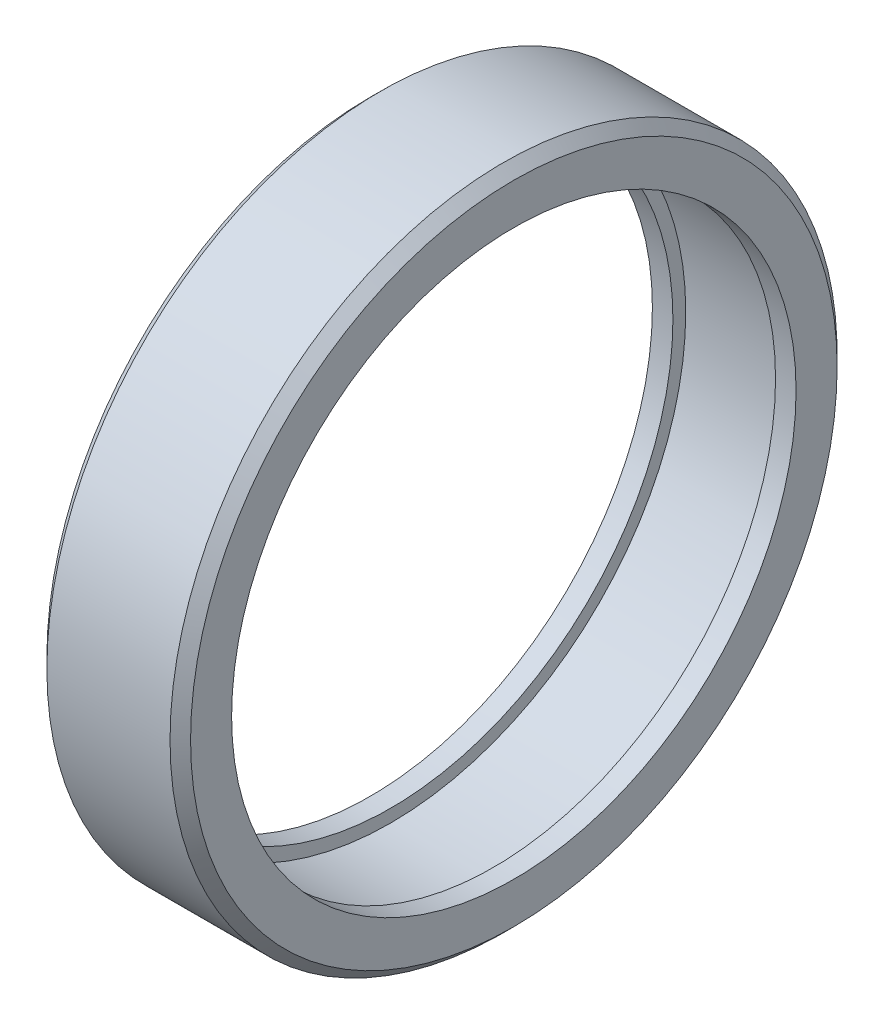
ISO-10303-21;
HEADER;
FILE_DESCRIPTION(('STEP AP214'),'2;1');
FILE_NAME('part.step','',(''),(''),'','','');
FILE_SCHEMA(('AUTOMOTIVE_DESIGN { 1 0 10303 214 1 1 1 1 }'));
ENDSEC;
DATA;
#1=APPLICATION_CONTEXT('core data for automotive mechanical design processes');
#2=APPLICATION_PROTOCOL_DEFINITION('international standard','automotive_design',2000,#1);
#3=PRODUCT_CONTEXT('',#1,'mechanical');
#4=PRODUCT('Part','Part','',(#3));
#5=PRODUCT_RELATED_PRODUCT_CATEGORY('part','',(#4));
#6=PRODUCT_DEFINITION_FORMATION('','',#4);
#7=PRODUCT_DEFINITION_CONTEXT('part definition',#1,'design');
#8=PRODUCT_DEFINITION('design','',#6,#7);
#9=PRODUCT_DEFINITION_SHAPE('','',#8);
#10=(LENGTH_UNIT() NAMED_UNIT(*) SI_UNIT(.MILLI.,.METRE.));
#11=(NAMED_UNIT(*) PLANE_ANGLE_UNIT() SI_UNIT($,.RADIAN.));
#12=(NAMED_UNIT(*) SI_UNIT($,.STERADIAN.) SOLID_ANGLE_UNIT());
#13=UNCERTAINTY_MEASURE_WITH_UNIT(LENGTH_MEASURE(1.E-05),#10,'distance_accuracy_value','');
#14=(GEOMETRIC_REPRESENTATION_CONTEXT(3) GLOBAL_UNCERTAINTY_ASSIGNED_CONTEXT((#13)) GLOBAL_UNIT_ASSIGNED_CONTEXT((#10,
#11,#12)) REPRESENTATION_CONTEXT('',''));
#15=CARTESIAN_POINT('',(0.,0.,0.));
#16=DIRECTION('',(0.,0.,1.));
#17=DIRECTION('',(1.,0.,0.));
#18=AXIS2_PLACEMENT_3D('',#15,#16,#17);
#19=CARTESIAN_POINT('',(-10.,55.,0.));
#20=DIRECTION('',(-1.,0.,0.));
#21=DIRECTION('',(0.,0.,1.));
#22=AXIS2_PLACEMENT_3D('',#19,#20,#21);
#23=PLANE('',#22);
#24=CARTESIAN_POINT('',(-10.,0.,0.));
#25=DIRECTION('',(-1.,0.,0.));
#26=DIRECTION('',(0.,0.,1.));
#27=AXIS2_PLACEMENT_3D('',#24,#25,#26);
#28=CIRCLE('',#27,57.5);
#29=CARTESIAN_POINT('',(-10.,0.,57.5));
#30=VERTEX_POINT('',#29);
#31=EDGE_CURVE('E64',#30,#30,#28,.T.);
#32=ORIENTED_EDGE('',*,*,#31,.F.);
#33=EDGE_LOOP('',(#32));
#34=FACE_BOUND('',#33,.T.);
#35=CARTESIAN_POINT('',(-10.,0.,0.));
#36=DIRECTION('',(-1.,0.,0.));
#37=DIRECTION('',(0.,0.,1.));
#38=AXIS2_PLACEMENT_3D('',#35,#36,#37);
#39=CIRCLE('',#38,55.);
#40=CARTESIAN_POINT('',(-10.,0.,55.));
#41=VERTEX_POINT('',#40);
#42=EDGE_CURVE('E84',#41,#41,#39,.T.);
#43=ORIENTED_EDGE('',*,*,#42,.T.);
#44=EDGE_LOOP('',(#43));
#45=FACE_BOUND('',#44,.T.);
#46=ADVANCED_FACE('F39',(#34,#45),#23,.F.);
#47=CARTESIAN_POINT('',(0.,0.,0.));
#48=DIRECTION('',(-1.,0.,0.));
#49=DIRECTION('',(0.,0.,1.));
#50=AXIS2_PLACEMENT_3D('',#47,#48,#49);
#51=CYLINDRICAL_SURFACE('',#50,57.5);
#52=CARTESIAN_POINT('',(10.,0.,0.));
#53=DIRECTION('',(-1.,0.,0.));
#54=DIRECTION('',(0.,0.,1.));
#55=AXIS2_PLACEMENT_3D('',#52,#53,#54);
#56=CIRCLE('',#55,57.5);
#57=CARTESIAN_POINT('',(10.,0.,57.5));
#58=VERTEX_POINT('',#57);
#59=EDGE_CURVE('E68',#58,#58,#56,.T.);
#60=ORIENTED_EDGE('',*,*,#59,.F.);
#61=EDGE_LOOP('',(#60));
#62=FACE_BOUND('',#61,.T.);
#63=ORIENTED_EDGE('',*,*,#31,.T.);
#64=EDGE_LOOP('',(#63));
#65=FACE_BOUND('',#64,.T.);
#66=ADVANCED_FACE('F108',(#62,#65),#51,.F.);
#67=CARTESIAN_POINT('',(10.,55.,0.));
#68=DIRECTION('',(1.,0.,0.));
#69=DIRECTION('',(0.,0.,-1.));
#70=AXIS2_PLACEMENT_3D('',#67,#68,#69);
#71=PLANE('',#70);
#72=CARTESIAN_POINT('',(10.,0.,0.));
#73=DIRECTION('',(-1.,0.,0.));
#74=DIRECTION('',(0.,0.,1.));
#75=AXIS2_PLACEMENT_3D('',#72,#73,#74);
#76=CIRCLE('',#75,55.);
#77=CARTESIAN_POINT('',(10.,0.,55.));
#78=VERTEX_POINT('',#77);
#79=EDGE_CURVE('E72',#78,#78,#76,.T.);
#80=ORIENTED_EDGE('',*,*,#79,.F.);
#81=EDGE_LOOP('',(#80));
#82=FACE_BOUND('',#81,.T.);
#83=ORIENTED_EDGE('',*,*,#59,.T.);
#84=EDGE_LOOP('',(#83));
#85=FACE_BOUND('',#84,.T.);
#86=ADVANCED_FACE('F114',(#82,#85),#71,.F.);
#87=CARTESIAN_POINT('',(0.,0.,0.));
#88=DIRECTION('',(-1.,0.,0.));
#89=DIRECTION('',(0.,0.,1.));
#90=AXIS2_PLACEMENT_3D('',#87,#88,#89);
#91=CYLINDRICAL_SURFACE('',#90,55.);
#92=CARTESIAN_POINT('',(14.,0.,0.));
#93=DIRECTION('',(-1.,0.,0.));
#94=DIRECTION('',(0.,0.,1.));
#95=AXIS2_PLACEMENT_3D('',#92,#93,#94);
#96=CIRCLE('',#95,55.);
#97=CARTESIAN_POINT('',(14.,0.,55.));
#98=VERTEX_POINT('',#97);
#99=EDGE_CURVE('E76',#98,#98,#96,.T.);
#100=ORIENTED_EDGE('',*,*,#99,.F.);
#101=EDGE_LOOP('',(#100));
#102=FACE_BOUND('',#101,.T.);
#103=ORIENTED_EDGE('',*,*,#79,.T.);
#104=EDGE_LOOP('',(#103));
#105=FACE_BOUND('',#104,.T.);
#106=ADVANCED_FACE('F159',(#102,#105),#91,.F.);
#107=CARTESIAN_POINT('',(14.,65.,0.));
#108=DIRECTION('',(-1.,0.,0.));
#109=DIRECTION('',(0.,0.,1.));
#110=AXIS2_PLACEMENT_3D('',#107,#108,#109);
#111=PLANE('',#110);
#112=CARTESIAN_POINT('',(14.,0.,0.));
#113=DIRECTION('',(-1.,0.,0.));
#114=DIRECTION('',(0.,0.,1.));
#115=AXIS2_PLACEMENT_3D('',#112,#113,#114);
#116=CIRCLE('',#115,63.);
#117=CARTESIAN_POINT('',(14.,0.,63.));
#118=VERTEX_POINT('',#117);
#119=EDGE_CURVE('E48',#118,#118,#116,.F.);
#120=ORIENTED_EDGE('',*,*,#119,.T.);
#121=EDGE_LOOP('',(#120));
#122=FACE_BOUND('',#121,.T.);
#123=ORIENTED_EDGE('',*,*,#99,.T.);
#124=EDGE_LOOP('',(#123));
#125=FACE_BOUND('',#124,.T.);
#126=ADVANCED_FACE('F104',(#122,#125),#111,.F.);
#127=CARTESIAN_POINT('',(0.,0.,0.));
#128=DIRECTION('',(-1.,0.,0.));
#129=DIRECTION('',(0.,0.,1.));
#130=AXIS2_PLACEMENT_3D('',#127,#128,#129);
#131=CYLINDRICAL_SURFACE('',#130,65.);
#132=CARTESIAN_POINT('',(12.,0.,0.));
#133=DIRECTION('',(-1.,0.,0.));
#134=DIRECTION('',(0.,0.,1.));
#135=AXIS2_PLACEMENT_3D('',#132,#133,#134);
#136=CIRCLE('',#135,65.);
#137=CARTESIAN_POINT('',(12.,0.,65.));
#138=VERTEX_POINT('',#137);
#139=EDGE_CURVE('E53',#138,#138,#136,.T.);
#140=ORIENTED_EDGE('',*,*,#139,.T.);
#141=EDGE_LOOP('',(#140));
#142=FACE_BOUND('',#141,.T.);
#143=CARTESIAN_POINT('',(-12.,0.,0.));
#144=DIRECTION('',(1.,0.,0.));
#145=DIRECTION('',(0.,0.,-1.));
#146=AXIS2_PLACEMENT_3D('',#143,#144,#145);
#147=CIRCLE('',#146,65.);
#148=CARTESIAN_POINT('',(-12.,0.,-65.));
#149=VERTEX_POINT('',#148);
#150=EDGE_CURVE('E58',#149,#149,#147,.T.);
#151=ORIENTED_EDGE('',*,*,#150,.T.);
#152=EDGE_LOOP('',(#151));
#153=FACE_BOUND('',#152,.T.);
#154=ADVANCED_FACE('F99',(#142,#153),#131,.T.);
#155=CARTESIAN_POINT('',(-14.,55.,0.));
#156=DIRECTION('',(1.,0.,0.));
#157=DIRECTION('',(0.,0.,-1.));
#158=AXIS2_PLACEMENT_3D('',#155,#156,#157);
#159=PLANE('',#158);
#160=CARTESIAN_POINT('',(-14.,0.,0.));
#161=DIRECTION('',(1.,0.,0.));
#162=DIRECTION('',(0.,0.,-1.));
#163=AXIS2_PLACEMENT_3D('',#160,#161,#162);
#164=CIRCLE('',#163,63.);
#165=CARTESIAN_POINT('',(-14.,0.,-63.));
#166=VERTEX_POINT('',#165);
#167=EDGE_CURVE('E10',#166,#166,#164,.F.);
#168=ORIENTED_EDGE('',*,*,#167,.T.);
#169=EDGE_LOOP('',(#168));
#170=FACE_BOUND('',#169,.T.);
#171=CARTESIAN_POINT('',(-14.,0.,0.));
#172=DIRECTION('',(-1.,0.,0.));
#173=DIRECTION('',(0.,0.,1.));
#174=AXIS2_PLACEMENT_3D('',#171,#172,#173);
#175=CIRCLE('',#174,55.);
#176=CARTESIAN_POINT('',(-14.,0.,55.));
#177=VERTEX_POINT('',#176);
#178=EDGE_CURVE('E80',#177,#177,#175,.T.);
#179=ORIENTED_EDGE('',*,*,#178,.F.);
#180=EDGE_LOOP('',(#179));
#181=FACE_BOUND('',#180,.T.);
#182=ADVANCED_FACE('F94',(#170,#181),#159,.F.);
#183=CARTESIAN_POINT('',(0.,0.,0.));
#184=DIRECTION('',(-1.,0.,0.));
#185=DIRECTION('',(0.,0.,1.));
#186=AXIS2_PLACEMENT_3D('',#183,#184,#185);
#187=CYLINDRICAL_SURFACE('',#186,55.);
#188=ORIENTED_EDGE('',*,*,#42,.F.);
#189=EDGE_LOOP('',(#188));
#190=FACE_BOUND('',#189,.T.);
#191=ORIENTED_EDGE('',*,*,#178,.T.);
#192=EDGE_LOOP('',(#191));
#193=FACE_BOUND('',#192,.T.);
#194=ADVANCED_FACE('F90',(#190,#193),#187,.F.);
#195=CARTESIAN_POINT('',(12.,0.,0.));
#196=DIRECTION('',(-1.,0.,0.));
#197=DIRECTION('',(0.,0.,1.));
#198=AXIS2_PLACEMENT_3D('',#195,#196,#197);
#199=CONICAL_SURFACE('',#198,65.,0.785398163397445);
#200=ORIENTED_EDGE('',*,*,#119,.F.);
#201=EDGE_LOOP('',(#200));
#202=FACE_BOUND('',#201,.T.);
#203=ORIENTED_EDGE('',*,*,#139,.F.);
#204=EDGE_LOOP('',(#203));
#205=FACE_BOUND('',#204,.T.);
#206=ADVANCED_FACE('F93',(#202,#205),#199,.T.);
#207=CARTESIAN_POINT('',(-14.,0.,0.));
#208=DIRECTION('',(1.,0.,0.));
#209=DIRECTION('',(0.,0.,-1.));
#210=AXIS2_PLACEMENT_3D('',#207,#208,#209);
#211=CONICAL_SURFACE('',#210,63.,0.785398163397441);
#212=ORIENTED_EDGE('',*,*,#150,.F.);
#213=EDGE_LOOP('',(#212));
#214=FACE_BOUND('',#213,.T.);
#215=ORIENTED_EDGE('',*,*,#167,.F.);
#216=EDGE_LOOP('',(#215));
#217=FACE_BOUND('',#216,.T.);
#218=ADVANCED_FACE('F42',(#214,#217),#211,.T.);
#219=CLOSED_SHELL('',(#46,#66,#86,#106,#126,#154,#182,#194,#206,#218));
#220=MANIFOLD_SOLID_BREP('B2',#219);
#221=ADVANCED_BREP_SHAPE_REPRESENTATION('',(#18,#220),#14);
#222=SHAPE_DEFINITION_REPRESENTATION(#9,#221);
ENDSEC;
END-ISO-10303-21;
